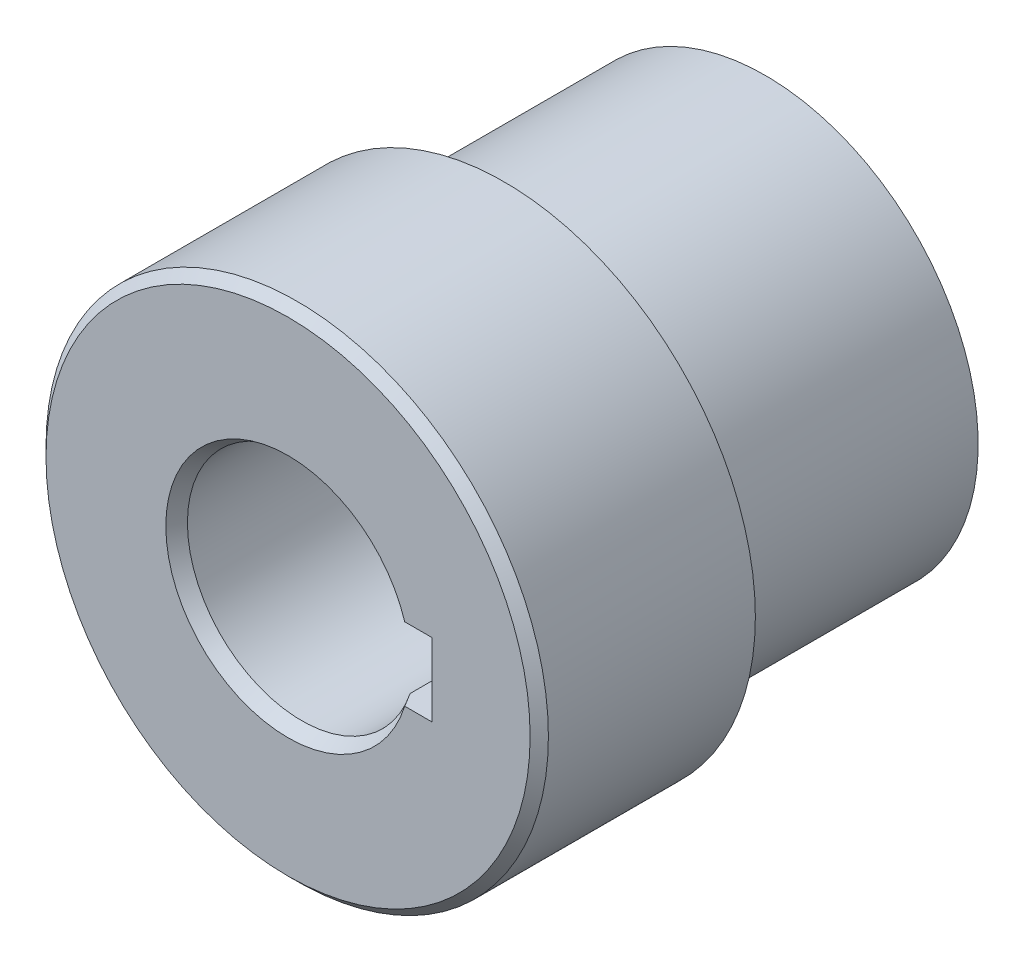
ISO-10303-21;
HEADER;
FILE_DESCRIPTION(('STEP AP214'),'2;1');
FILE_NAME('part.step','',(''),(''),'','','');
FILE_SCHEMA(('AUTOMOTIVE_DESIGN { 1 0 10303 214 1 1 1 1 }'));
ENDSEC;
DATA;
#1=APPLICATION_CONTEXT('core data for automotive mechanical design processes');
#2=APPLICATION_PROTOCOL_DEFINITION('international standard','automotive_design',2000,#1);
#3=PRODUCT_CONTEXT('',#1,'mechanical');
#4=PRODUCT('Part','Part','',(#3));
#5=PRODUCT_RELATED_PRODUCT_CATEGORY('part','',(#4));
#6=PRODUCT_DEFINITION_FORMATION('','',#4);
#7=PRODUCT_DEFINITION_CONTEXT('part definition',#1,'design');
#8=PRODUCT_DEFINITION('design','',#6,#7);
#9=PRODUCT_DEFINITION_SHAPE('','',#8);
#10=(LENGTH_UNIT() NAMED_UNIT(*) SI_UNIT(.MILLI.,.METRE.));
#11=(NAMED_UNIT(*) PLANE_ANGLE_UNIT() SI_UNIT($,.RADIAN.));
#12=(NAMED_UNIT(*) SI_UNIT($,.STERADIAN.) SOLID_ANGLE_UNIT());
#13=UNCERTAINTY_MEASURE_WITH_UNIT(LENGTH_MEASURE(1.E-05),#10,'distance_accuracy_value','');
#14=(GEOMETRIC_REPRESENTATION_CONTEXT(3) GLOBAL_UNCERTAINTY_ASSIGNED_CONTEXT((#13)) GLOBAL_UNIT_ASSIGNED_CONTEXT((#10,
#11,#12)) REPRESENTATION_CONTEXT('',''));
#15=CARTESIAN_POINT('',(0.,0.,0.));
#16=DIRECTION('',(0.,0.,1.));
#17=DIRECTION('',(1.,0.,0.));
#18=AXIS2_PLACEMENT_3D('',#15,#16,#17);
#19=CARTESIAN_POINT('',(-175.,0.,95.));
#20=DIRECTION('',(0.,0.,-1.));
#21=DIRECTION('',(-1.,0.,0.));
#22=AXIS2_PLACEMENT_3D('',#19,#20,#21);
#23=CYLINDRICAL_SURFACE('',#22,23.2982503633935);
#24=CARTESIAN_POINT('',(-175.,0.,111.342339957943));
#25=DIRECTION('',(0.,0.,-1.));
#26=DIRECTION('',(-1.,0.,0.));
#27=AXIS2_PLACEMENT_3D('',#24,#25,#26);
#28=CIRCLE('',#27,23.2982503633935);
#29=CARTESIAN_POINT('',(-198.298250363394,0.,111.342339957943));
#30=VERTEX_POINT('',#29);
#31=EDGE_CURVE('E262',#30,#30,#28,.T.);
#32=ORIENTED_EDGE('',*,*,#31,.T.);
#33=EDGE_LOOP('',(#32));
#34=FACE_BOUND('',#33,.T.);
#35=CARTESIAN_POINT('',(-175.,0.,82.7503321236277));
#36=DIRECTION('',(0.,0.,-1.));
#37=DIRECTION('',(-1.,0.,0.));
#38=AXIS2_PLACEMENT_3D('',#35,#36,#37);
#39=CIRCLE('',#38,23.2982503633935);
#40=CARTESIAN_POINT('',(-198.298250363394,0.,82.7503321236277));
#41=VERTEX_POINT('',#40);
#42=EDGE_CURVE('E256',#41,#41,#39,.T.);
#43=ORIENTED_EDGE('',*,*,#42,.F.);
#44=EDGE_LOOP('',(#43));
#45=FACE_BOUND('',#44,.T.);
#46=ADVANCED_FACE('F17',(#34,#45),#23,.T.);
#47=CARTESIAN_POINT('',(-207.236290395728,0.,111.342339957943));
#48=DIRECTION('',(0.,0.,1.));
#49=DIRECTION('',(1.,0.,0.));
#50=AXIS2_PLACEMENT_3D('',#47,#48,#49);
#51=PLANE('',#50);
#52=ORIENTED_EDGE('',*,*,#31,.F.);
#53=EDGE_LOOP('',(#52));
#54=FACE_BOUND('',#53,.T.);
#55=CARTESIAN_POINT('',(-175.,0.,111.342339957948));
#56=DIRECTION('',(0.,0.,1.));
#57=DIRECTION('',(1.,0.,0.));
#58=AXIS2_PLACEMENT_3D('',#55,#56,#57);
#59=CIRCLE('',#58,27.5);
#60=CARTESIAN_POINT('',(-147.5,0.,111.342339957948));
#61=VERTEX_POINT('',#60);
#62=EDGE_CURVE('E251',#61,#61,#59,.T.);
#63=ORIENTED_EDGE('',*,*,#62,.F.);
#64=EDGE_LOOP('',(#63));
#65=FACE_BOUND('',#64,.T.);
#66=ADVANCED_FACE('F221',(#54,#65),#51,.F.);
#67=CARTESIAN_POINT('',(-198.298250363393,0.,82.7503321236277));
#68=DIRECTION('',(0.,0.,1.));
#69=DIRECTION('',(1.,0.,0.));
#70=AXIS2_PLACEMENT_3D('',#67,#68,#69);
#71=PLANE('',#70);
#72=ORIENTED_EDGE('',*,*,#42,.T.);
#73=EDGE_LOOP('',(#72));
#74=FACE_BOUND('',#73,.T.);
#75=ADVANCED_FACE('F227',(#74),#71,.F.);
#76=CARTESIAN_POINT('',(-175.,0.,-200000.));
#77=DIRECTION('',(0.,0.,-1.));
#78=DIRECTION('',(-1.,0.,0.));
#79=AXIS2_PLACEMENT_3D('',#76,#77,#78);
#80=CYLINDRICAL_SURFACE('',#79,27.5);
#81=CARTESIAN_POINT('',(-175.,0.,134.));
#82=DIRECTION('',(0.,0.,-1.));
#83=DIRECTION('',(-1.,0.,0.));
#84=AXIS2_PLACEMENT_3D('',#81,#82,#83);
#85=CIRCLE('',#84,27.5);
#86=CARTESIAN_POINT('',(-202.5,0.,134.));
#87=VERTEX_POINT('',#86);
#88=EDGE_CURVE('E102',#87,#87,#85,.T.);
#89=ORIENTED_EDGE('',*,*,#88,.T.);
#90=EDGE_LOOP('',(#89));
#91=FACE_BOUND('',#90,.T.);
#92=ORIENTED_EDGE('',*,*,#62,.T.);
#93=EDGE_LOOP('',(#92));
#94=FACE_BOUND('',#93,.T.);
#95=ADVANCED_FACE('F235',(#91,#94),#80,.T.);
#96=CARTESIAN_POINT('',(-175.,0.,133.999999999986));
#97=DIRECTION('',(0.,0.,-1.));
#98=DIRECTION('',(-1.,0.,0.));
#99=AXIS2_PLACEMENT_3D('',#96,#97,#98);
#100=CONICAL_SURFACE('',#99,27.5,0.785398163408204);
#101=CARTESIAN_POINT('',(-175.,0.,135.));
#102=DIRECTION('',(0.,0.,1.));
#103=DIRECTION('',(-1.,0.,0.));
#104=AXIS2_PLACEMENT_3D('',#101,#102,#103);
#105=CIRCLE('',#104,26.4999999999645);
#106=CARTESIAN_POINT('',(-201.499999999964,0.,135.));
#107=VERTEX_POINT('',#106);
#108=EDGE_CURVE('E95',#107,#107,#105,.T.);
#109=ORIENTED_EDGE('',*,*,#108,.F.);
#110=EDGE_LOOP('',(#109));
#111=FACE_BOUND('',#110,.T.);
#112=ORIENTED_EDGE('',*,*,#88,.F.);
#113=EDGE_LOOP('',(#112));
#114=FACE_BOUND('',#113,.T.);
#115=ADVANCED_FACE('F238',(#111,#114),#100,.T.);
#116=CARTESIAN_POINT('',(-147.5,0.,135.));
#117=DIRECTION('',(0.,0.,-1.));
#118=DIRECTION('',(-1.,0.,0.));
#119=AXIS2_PLACEMENT_3D('',#116,#117,#118);
#120=PLANE('',#119);
#121=ORIENTED_EDGE('',*,*,#108,.T.);
#122=EDGE_LOOP('',(#121));
#123=FACE_BOUND('',#122,.T.);
#124=CARTESIAN_POINT('',(-175.,0.,135.));
#125=DIRECTION('',(0.,0.,1.));
#126=DIRECTION('',(0.954292295873439,0.298874913695681,0.));
#127=AXIS2_PLACEMENT_3D('',#124,#125,#126);
#128=CIRCLE('',#127,13.3835254037845);
#129=CARTESIAN_POINT('',(-162.228204815542,4.,135.));
#130=VERTEX_POINT('',#129);
#131=CARTESIAN_POINT('',(-162.228204815542,-4.,135.));
#132=VERTEX_POINT('',#131);
#133=EDGE_CURVE('E78',#130,#132,#128,.T.);
#134=ORIENTED_EDGE('',*,*,#133,.F.);
#135=DIRECTION('',(-1.,0.,0.));
#136=VECTOR('',#135,1.);
#137=CARTESIAN_POINT('',(-159.2175,4.,135.));
#138=LINE('',#137,#136);
#139=CARTESIAN_POINT('',(-159.2175,4.,135.));
#140=VERTEX_POINT('',#139);
#141=EDGE_CURVE('E64',#140,#130,#138,.T.);
#142=ORIENTED_EDGE('',*,*,#141,.F.);
#143=DIRECTION('',(0.,1.,0.));
#144=VECTOR('',#143,1.);
#145=CARTESIAN_POINT('',(-159.2175,-4.,135.));
#146=LINE('',#145,#144);
#147=CARTESIAN_POINT('',(-159.2175,-4.,135.));
#148=VERTEX_POINT('',#147);
#149=EDGE_CURVE('E77',#148,#140,#146,.T.);
#150=ORIENTED_EDGE('',*,*,#149,.F.);
#151=DIRECTION('',(1.,0.,0.));
#152=VECTOR('',#151,1.);
#153=CARTESIAN_POINT('',(-162.228204815542,-4.,135.));
#154=LINE('',#153,#152);
#155=EDGE_CURVE('E93',#132,#148,#154,.T.);
#156=ORIENTED_EDGE('',*,*,#155,.F.);
#157=EDGE_LOOP('',(#134,#142,#150,#156));
#158=FACE_BOUND('',#157,.T.);
#159=ADVANCED_FACE('F92',(#123,#158),#120,.F.);
#160=CARTESIAN_POINT('',(-175.,0.,133.5));
#161=DIRECTION('',(0.,0.,1.));
#162=DIRECTION('',(1.,0.,0.));
#163=AXIS2_PLACEMENT_3D('',#160,#161,#162);
#164=CONICAL_SURFACE('',#163,12.5175,0.523598775598312);
#165=CARTESIAN_POINT('',(-162.228204815542,-4.00000000000001,135.));
#166=CARTESIAN_POINT('',(-162.247138678653,-3.99999999577629,134.968704542875));
#167=CARTESIAN_POINT('',(-162.266075280834,-3.99999993231382,134.937410742874));
#168=CARTESIAN_POINT('',(-162.30394838772,-3.99999975381501,134.874835869454));
#169=CARTESIAN_POINT('',(-162.32288489076,-3.9999996387941,134.843554795029));
#170=CARTESIAN_POINT('',(-162.360759266996,-3.99999942402382,134.781003137521));
#171=CARTESIAN_POINT('',(-162.379697138914,-3.99999932427102,134.749732553664));
#172=CARTESIAN_POINT('',(-162.417575716104,-3.99999917656243,134.687199641411));
#173=CARTESIAN_POINT('',(-162.4365164205,-3.99999912859872,134.655937312483));
#174=CARTESIAN_POINT('',(-162.474402122828,-3.99999909933543,134.593418674448));
#175=CARTESIAN_POINT('',(-162.493347120296,-3.99999911803051,134.56216236506));
#176=CARTESIAN_POINT('',(-162.531242864791,-3.99999921010772,134.499653530084));
#177=CARTESIAN_POINT('',(-162.550193611778,-3.99999928348947,134.468401004472));
#178=CARTESIAN_POINT('',(-162.588102309761,-3.99999945746956,134.405897502272));
#179=CARTESIAN_POINT('',(-162.60706026115,-3.99999955806971,134.374646525921));
#180=CARTESIAN_POINT('',(-162.644984811039,-3.99999970253558,134.312143882838));
#181=CARTESIAN_POINT('',(-162.663951410373,-3.99999974639342,134.280892216613));
#182=CARTESIAN_POINT('',(-162.701894039618,-3.99999978876423,134.218387098745));
#183=CARTESIAN_POINT('',(-162.720870070601,-3.99999978726922,134.187133647755));
#184=CARTESIAN_POINT('',(-162.758830458185,-3.99999981739231,134.124627016906));
#185=CARTESIAN_POINT('',(-162.77781481548,-3.99999984901412,134.09337383747));
#186=CARTESIAN_POINT('',(-162.815790454387,-3.99999990777795,134.030870231961));
#187=CARTESIAN_POINT('',(-162.834781736212,-3.99999993491981,133.999619806017));
#188=CARTESIAN_POINT('',(-162.87276983124,-3.99999998318214,133.937124194355));
#189=CARTESIAN_POINT('',(-162.891766644162,-4.00000000430287,133.905879008467));
#190=CARTESIAN_POINT('',(-162.929764407175,-4.00000003444872,133.843396362538));
#191=CARTESIAN_POINT('',(-162.94876535648,-4.0000000434753,133.812158902019));
#192=CARTESIAN_POINT('',(-162.98676999948,-4.00000005002319,133.749694192826));
#193=CARTESIAN_POINT('',(-163.005773691871,-4.00000004754679,133.718466943359));
#194=CARTESIAN_POINT('',(-163.043782428785,-4.00000003515554,133.656025142053));
#195=CARTESIAN_POINT('',(-163.06278747147,-4.00000002524274,133.624810589095));
#196=CARTESIAN_POINT('',(-163.100797518465,-4.00000000809256,133.562396667126));
#197=CARTESIAN_POINT('',(-163.119802520389,-4.00000000085423,133.531197296662));
#198=CARTESIAN_POINT('',(-163.138810925965,-3.99999999999994,133.5));
#199=B_SPLINE_CURVE_WITH_KNOTS('',3,(#165,#166,#167,#168,#169,#170,#171,#172,#173,#174,#175,
#176,#177,#178,#179,#180,#181,#182,#183,#184,#185,#186,#187,#188,#189,#190,#191,#192,#193,#194,
#195,#196,#197,#198),.UNSPECIFIED.,.F.,.F.,(4,2,2,2,2,2,2,2,2,2,2,2,2,2,2,2,4),(0.,
0.109731815151324,0.219430815848875,0.32910502218035,0.438762449200957,0.548411106786936,
0.658058999482707,0.767714126342558,0.877384480766448,0.987074094681261,1.09677597826032,
1.20648158886931,1.31618238518873,1.42586982728635,1.5355353766921,1.64517049647521,
1.75476665132419),.UNSPECIFIED.);
#200=CARTESIAN_POINT('',(-163.138810925965,-4.,133.5));
#201=VERTEX_POINT('',#200);
#202=EDGE_CURVE('E116',#132,#201,#199,.T.);
#203=ORIENTED_EDGE('',*,*,#202,.T.);
#204=CARTESIAN_POINT('',(-175.,0.,133.5));
#205=DIRECTION('',(0.,0.,1.));
#206=DIRECTION('',(0.947568529980804,0.319552626323143,0.));
#207=AXIS2_PLACEMENT_3D('',#204,#205,#206);
#208=CIRCLE('',#207,12.5175);
#209=CARTESIAN_POINT('',(-163.138810925965,4.,133.5));
#210=VERTEX_POINT('',#209);
#211=EDGE_CURVE('E86',#210,#201,#208,.T.);
#212=ORIENTED_EDGE('',*,*,#211,.F.);
#213=CARTESIAN_POINT('',(-163.138810925965,3.99999999999993,133.5));
#214=CARTESIAN_POINT('',(-163.119800009447,4.00000000027047,133.531201417372));
#215=CARTESIAN_POINT('',(-163.100792495697,3.99999999961333,133.562404908008));
#216=CARTESIAN_POINT('',(-163.062778714028,3.9999999949423,133.62482495446));
#217=CARTESIAN_POINT('',(-163.043772448039,3.99999999092745,133.656041511452));
#218=CARTESIAN_POINT('',(-163.005762268724,3.99999997803624,133.718485674449));
#219=CARTESIAN_POINT('',(-162.986758356887,3.9999999691588,133.749713281362));
#220=CARTESIAN_POINT('',(-162.948753993676,3.99999994696922,133.81217752841));
#221=CARTESIAN_POINT('',(-162.92975354336,3.99999993365636,133.843414169191));
#222=CARTESIAN_POINT('',(-162.891757211065,3.99999990367963,133.905894468012));
#223=CARTESIAN_POINT('',(-162.872761329725,3.99999988701542,133.937138126441));
#224=CARTESIAN_POINT('',(-162.834775244045,3.99999985440616,133.999630444878));
#225=CARTESIAN_POINT('',(-162.815785039936,3.99999983846114,134.030879105025));
#226=CARTESIAN_POINT('',(-162.777811416029,3.9999998054761,134.093379410216));
#227=CARTESIAN_POINT('',(-162.758827996064,3.9999997884361,134.124631055157));
#228=CARTESIAN_POINT('',(-162.720869054086,3.99999977789805,134.187135316933));
#229=CARTESIAN_POINT('',(-162.701893531519,3.99999978439789,134.218387933431));
#230=CARTESIAN_POINT('',(-162.66395127342,3.99999975075839,134.280892444559));
#231=CARTESIAN_POINT('',(-162.644984537023,3.99999971062566,134.312144338665));
#232=CARTESIAN_POINT('',(-162.607059219782,3.99999958223045,134.374648255135));
#233=CARTESIAN_POINT('',(-162.58810063826,3.9999994939734,134.405900277089));
#234=CARTESIAN_POINT('',(-162.550190451621,3.99999934157723,134.468406246246));
#235=CARTESIAN_POINT('',(-162.531238846183,3.99999927743682,134.499660193255));
#236=CARTESIAN_POINT('',(-162.493341423205,3.99999919820752,134.562171805834));
#237=CARTESIAN_POINT('',(-162.474395605692,3.99999918311888,134.593429471422));
#238=CARTESIAN_POINT('',(-162.436508568491,3.99999921231379,134.655950315471));
#239=CARTESIAN_POINT('',(-162.417567349172,3.99999925660113,134.687213494157));
#240=CARTESIAN_POINT('',(-162.379688314666,3.99999939116034,134.749747158421));
#241=CARTESIAN_POINT('',(-162.360750500182,3.99999948143785,134.781017644424));
#242=CARTESIAN_POINT('',(-162.322877078971,3.99999967523075,134.843567717553));
#243=CARTESIAN_POINT('',(-162.30394147327,3.99999977874853,134.874847305302));
#244=CARTESIAN_POINT('',(-162.266071269374,3.99999993925094,134.937417375621));
#245=CARTESIAN_POINT('',(-162.247136672517,3.99999999622436,134.968707859003));
#246=CARTESIAN_POINT('',(-162.228204815542,3.99999999999999,135.));
#247=B_SPLINE_CURVE_WITH_KNOTS('',3,(#213,#214,#215,#216,#217,#218,#219,#220,#221,#222,#223,
#224,#225,#226,#227,#228,#229,#230,#231,#232,#233,#234,#235,#236,#237,#238,#239,#240,#241,#242,
#243,#244,#245,#246),.UNSPECIFIED.,.F.,.F.,(4,2,2,2,2,2,2,2,2,2,2,2,2,2,2,2,4),(0.,
0.109610631234623,0.219252794706676,0.328919602398937,0.438604165496042,0.54829959443689,
0.65799899896569,0.767695488180886,0.87738217058274,0.987053322770528,1.09671211201644,
1.20636498624649,1.31601839838094,1.42567880619194,1.53535267216603,1.64504646337152,
1.75476665133078),.UNSPECIFIED.);
#248=EDGE_CURVE('E68',#210,#130,#247,.T.);
#249=ORIENTED_EDGE('',*,*,#248,.T.);
#250=ORIENTED_EDGE('',*,*,#133,.T.);
#251=EDGE_LOOP('',(#203,#212,#249,#250));
#252=FACE_BOUND('',#251,.T.);
#253=ADVANCED_FACE('F85',(#252),#164,.F.);
#254=CARTESIAN_POINT('',(-159.2175,4.,95.));
#255=DIRECTION('',(0.,1.,0.));
#256=DIRECTION('',(1.,0.,0.));
#257=AXIS2_PLACEMENT_3D('',#254,#255,#256);
#258=PLANE('',#257);
#259=ORIENTED_EDGE('',*,*,#248,.F.);
#260=DIRECTION('',(0.,0.,1.));
#261=VECTOR('',#260,1.);
#262=CARTESIAN_POINT('',(-163.138810925965,4.,95.));
#263=LINE('',#262,#261);
#264=CARTESIAN_POINT('',(-163.138810925965,4.,95.));
#265=VERTEX_POINT('',#264);
#266=EDGE_CURVE('E88',#265,#210,#263,.T.);
#267=ORIENTED_EDGE('',*,*,#266,.F.);
#268=DIRECTION('',(-1.,0.,0.));
#269=VECTOR('',#268,1.);
#270=CARTESIAN_POINT('',(-159.2175,4.,95.));
#271=LINE('',#270,#269);
#272=CARTESIAN_POINT('',(-159.2175,4.,95.));
#273=VERTEX_POINT('',#272);
#274=EDGE_CURVE('E155',#273,#265,#271,.T.);
#275=ORIENTED_EDGE('',*,*,#274,.F.);
#276=DIRECTION('',(0.,0.,1.));
#277=VECTOR('',#276,1.);
#278=CARTESIAN_POINT('',(-159.2175,4.,95.));
#279=LINE('',#278,#277);
#280=EDGE_CURVE('E72',#273,#140,#279,.T.);
#281=ORIENTED_EDGE('',*,*,#280,.T.);
#282=ORIENTED_EDGE('',*,*,#141,.T.);
#283=EDGE_LOOP('',(#259,#267,#275,#281,#282));
#284=FACE_BOUND('',#283,.T.);
#285=ADVANCED_FACE('F66',(#284),#258,.F.);
#286=CARTESIAN_POINT('',(-159.2175,4.,95.));
#287=DIRECTION('',(1.,0.,0.));
#288=DIRECTION('',(0.,0.,-1.));
#289=AXIS2_PLACEMENT_3D('',#286,#287,#288);
#290=PLANE('',#289);
#291=ORIENTED_EDGE('',*,*,#149,.T.);
#292=ORIENTED_EDGE('',*,*,#280,.F.);
#293=DIRECTION('',(0.,1.,0.));
#294=VECTOR('',#293,1.);
#295=CARTESIAN_POINT('',(-159.2175,-4.,95.));
#296=LINE('',#295,#294);
#297=CARTESIAN_POINT('',(-159.2175,-4.,95.));
#298=VERTEX_POINT('',#297);
#299=EDGE_CURVE('E164',#298,#273,#296,.T.);
#300=ORIENTED_EDGE('',*,*,#299,.F.);
#301=DIRECTION('',(0.,0.,1.));
#302=VECTOR('',#301,1.);
#303=CARTESIAN_POINT('',(-159.2175,-4.,95.));
#304=LINE('',#303,#302);
#305=EDGE_CURVE('E169',#298,#148,#304,.T.);
#306=ORIENTED_EDGE('',*,*,#305,.T.);
#307=EDGE_LOOP('',(#291,#292,#300,#306));
#308=FACE_BOUND('',#307,.T.);
#309=ADVANCED_FACE('F195',(#308),#290,.F.);
#310=CARTESIAN_POINT('',(-159.2175,-4.,95.));
#311=DIRECTION('',(0.,-1.,0.));
#312=DIRECTION('',(-1.,0.,0.));
#313=AXIS2_PLACEMENT_3D('',#310,#311,#312);
#314=PLANE('',#313);
#315=ORIENTED_EDGE('',*,*,#202,.F.);
#316=ORIENTED_EDGE('',*,*,#155,.T.);
#317=ORIENTED_EDGE('',*,*,#305,.F.);
#318=DIRECTION('',(1.,0.,0.));
#319=VECTOR('',#318,1.);
#320=CARTESIAN_POINT('',(-163.138810925965,-4.,95.));
#321=LINE('',#320,#319);
#322=CARTESIAN_POINT('',(-163.138810925965,-4.,95.));
#323=VERTEX_POINT('',#322);
#324=EDGE_CURVE('E37',#323,#298,#321,.T.);
#325=ORIENTED_EDGE('',*,*,#324,.F.);
#326=DIRECTION('',(0.,0.,1.));
#327=VECTOR('',#326,1.);
#328=CARTESIAN_POINT('',(-163.138810925965,-4.,95.));
#329=LINE('',#328,#327);
#330=EDGE_CURVE('E343',#323,#201,#329,.T.);
#331=ORIENTED_EDGE('',*,*,#330,.T.);
#332=EDGE_LOOP('',(#315,#316,#317,#325,#331));
#333=FACE_BOUND('',#332,.T.);
#334=ADVANCED_FACE('F185',(#333),#314,.F.);
#335=CARTESIAN_POINT('',(-175.,0.,95.));
#336=DIRECTION('',(0.,0.,1.));
#337=DIRECTION('',(1.,0.,0.));
#338=AXIS2_PLACEMENT_3D('',#335,#336,#337);
#339=CYLINDRICAL_SURFACE('',#338,12.5175);
#340=ORIENTED_EDGE('',*,*,#266,.T.);
#341=ORIENTED_EDGE('',*,*,#211,.T.);
#342=ORIENTED_EDGE('',*,*,#330,.F.);
#343=CARTESIAN_POINT('',(-175.,0.,95.));
#344=DIRECTION('',(0.,0.,1.));
#345=DIRECTION('',(0.947568529980804,0.319552626323143,0.));
#346=AXIS2_PLACEMENT_3D('',#343,#344,#345);
#347=CIRCLE('',#346,12.5175);
#348=EDGE_CURVE('E33',#265,#323,#347,.T.);
#349=ORIENTED_EDGE('',*,*,#348,.F.);
#350=EDGE_LOOP('',(#340,#341,#342,#349));
#351=FACE_BOUND('',#350,.T.);
#352=ADVANCED_FACE('F194',(#351),#339,.F.);
#353=CARTESIAN_POINT('',(-175.,-12.5175,95.));
#354=DIRECTION('',(0.,0.,-1.));
#355=DIRECTION('',(-1.,0.,0.));
#356=AXIS2_PLACEMENT_3D('',#353,#354,#355);
#357=PLANE('',#356);
#358=CARTESIAN_POINT('',(-175.,0.,95.));
#359=DIRECTION('',(0.,0.,1.));
#360=DIRECTION('',(1.,0.,0.));
#361=AXIS2_PLACEMENT_3D('',#358,#359,#360);
#362=CIRCLE('',#361,16.5);
#363=CARTESIAN_POINT('',(-158.5,0.,95.));
#364=VERTEX_POINT('',#363);
#365=EDGE_CURVE('E355',#364,#364,#362,.T.);
#366=ORIENTED_EDGE('',*,*,#365,.F.);
#367=EDGE_LOOP('',(#366));
#368=FACE_BOUND('',#367,.T.);
#369=ORIENTED_EDGE('',*,*,#274,.T.);
#370=ORIENTED_EDGE('',*,*,#348,.T.);
#371=ORIENTED_EDGE('',*,*,#324,.T.);
#372=ORIENTED_EDGE('',*,*,#299,.T.);
#373=EDGE_LOOP('',(#369,#370,#371,#372));
#374=FACE_BOUND('',#373,.T.);
#375=ADVANCED_FACE('F198',(#368,#374),#357,.T.);
#376=CARTESIAN_POINT('',(-175.,0.,94.));
#377=DIRECTION('',(0.,0.,1.));
#378=DIRECTION('',(1.,0.,0.));
#379=AXIS2_PLACEMENT_3D('',#376,#377,#378);
#380=TOROIDAL_SURFACE('',#379,16.5,1.);
#381=CARTESIAN_POINT('',(-175.,0.,94.));
#382=DIRECTION('',(0.,0.,1.));
#383=DIRECTION('',(1.,0.,0.));
#384=AXIS2_PLACEMENT_3D('',#381,#382,#383);
#385=CIRCLE('',#384,17.5);
#386=CARTESIAN_POINT('',(-157.5,0.,94.));
#387=VERTEX_POINT('',#386);
#388=EDGE_CURVE('E363',#387,#387,#385,.T.);
#389=ORIENTED_EDGE('',*,*,#388,.F.);
#390=EDGE_LOOP('',(#389));
#391=FACE_BOUND('',#390,.T.);
#392=ORIENTED_EDGE('',*,*,#365,.T.);
#393=EDGE_LOOP('',(#392));
#394=FACE_BOUND('',#393,.T.);
#395=ADVANCED_FACE('F202',(#391,#394),#380,.F.);
#396=CARTESIAN_POINT('',(-175.,0.,135.));
#397=DIRECTION('',(0.,0.,1.));
#398=DIRECTION('',(1.,0.,0.));
#399=AXIS2_PLACEMENT_3D('',#396,#397,#398);
#400=CYLINDRICAL_SURFACE('',#399,17.5);
#401=CARTESIAN_POINT('',(-175.,0.,89.));
#402=DIRECTION('',(0.,0.,1.));
#403=DIRECTION('',(1.,0.,0.));
#404=AXIS2_PLACEMENT_3D('',#401,#402,#403);
#405=CIRCLE('',#404,17.5);
#406=CARTESIAN_POINT('',(-157.5,0.,89.));
#407=VERTEX_POINT('',#406);
#408=EDGE_CURVE('E26',#407,#407,#405,.T.);
#409=ORIENTED_EDGE('',*,*,#408,.F.);
#410=EDGE_LOOP('',(#409));
#411=FACE_BOUND('',#410,.T.);
#412=ORIENTED_EDGE('',*,*,#388,.T.);
#413=EDGE_LOOP('',(#412));
#414=FACE_BOUND('',#413,.T.);
#415=ADVANCED_FACE('F206',(#411,#414),#400,.F.);
#416=CARTESIAN_POINT('',(-175.,0.,89.));
#417=DIRECTION('',(0.,0.,1.));
#418=DIRECTION('',(1.,0.,0.));
#419=AXIS2_PLACEMENT_3D('',#416,#417,#418);
#420=TOROIDAL_SURFACE('',#419,16.5,1.);
#421=CARTESIAN_POINT('',(-175.,0.,88.));
#422=DIRECTION('',(0.,0.,1.));
#423=DIRECTION('',(1.,0.,0.));
#424=AXIS2_PLACEMENT_3D('',#421,#422,#423);
#425=CIRCLE('',#424,16.5);
#426=CARTESIAN_POINT('',(-158.5,0.,88.));
#427=VERTEX_POINT('',#426);
#428=EDGE_CURVE('E11',#427,#427,#425,.T.);
#429=ORIENTED_EDGE('',*,*,#428,.F.);
#430=EDGE_LOOP('',(#429));
#431=FACE_BOUND('',#430,.T.);
#432=ORIENTED_EDGE('',*,*,#408,.T.);
#433=EDGE_LOOP('',(#432));
#434=FACE_BOUND('',#433,.T.);
#435=ADVANCED_FACE('F209',(#431,#434),#420,.F.);
#436=CARTESIAN_POINT('',(-175.,-16.5,88.));
#437=DIRECTION('',(0.,0.,1.));
#438=DIRECTION('',(1.,0.,0.));
#439=AXIS2_PLACEMENT_3D('',#436,#437,#438);
#440=PLANE('',#439);
#441=ORIENTED_EDGE('',*,*,#428,.T.);
#442=EDGE_LOOP('',(#441));
#443=FACE_BOUND('',#442,.T.);
#444=ADVANCED_FACE('F19',(#443),#440,.T.);
#445=CLOSED_SHELL('',(#46,#66,#75,#95,#115,#159,#253,#285,#309,#334,#352,#375,#395,#415,#435,#444));
#446=MANIFOLD_SOLID_BREP('B1',#445);
#447=ADVANCED_BREP_SHAPE_REPRESENTATION('',(#18,#446),#14);
#448=SHAPE_DEFINITION_REPRESENTATION(#9,#447);
ENDSEC;
END-ISO-10303-21;
